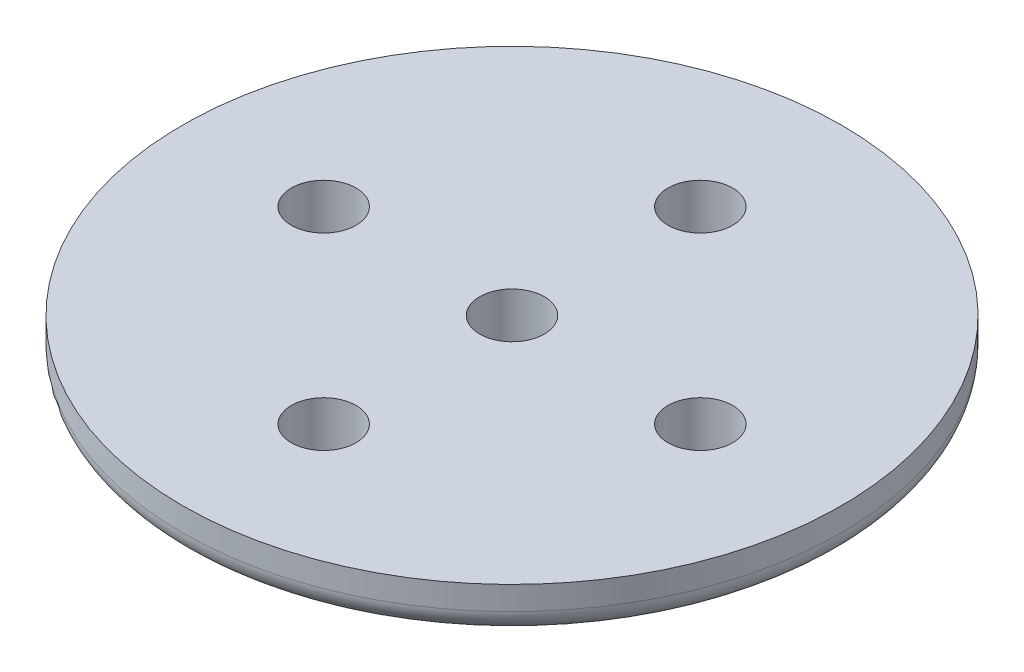
ISO-10303-21;
HEADER;
FILE_DESCRIPTION(('STEP AP214'),'2;1');
FILE_NAME('part.step','',(''),(''),'','','');
FILE_SCHEMA(('AUTOMOTIVE_DESIGN { 1 0 10303 214 1 1 1 1 }'));
ENDSEC;
DATA;
#1=APPLICATION_CONTEXT('core data for automotive mechanical design processes');
#2=APPLICATION_PROTOCOL_DEFINITION('international standard','automotive_design',2000,#1);
#3=PRODUCT_CONTEXT('',#1,'mechanical');
#4=PRODUCT('Part','Part','',(#3));
#5=PRODUCT_RELATED_PRODUCT_CATEGORY('part','',(#4));
#6=PRODUCT_DEFINITION_FORMATION('','',#4);
#7=PRODUCT_DEFINITION_CONTEXT('part definition',#1,'design');
#8=PRODUCT_DEFINITION('design','',#6,#7);
#9=PRODUCT_DEFINITION_SHAPE('','',#8);
#10=(LENGTH_UNIT() NAMED_UNIT(*) SI_UNIT(.MILLI.,.METRE.));
#11=(NAMED_UNIT(*) PLANE_ANGLE_UNIT() SI_UNIT($,.RADIAN.));
#12=(NAMED_UNIT(*) SI_UNIT($,.STERADIAN.) SOLID_ANGLE_UNIT());
#13=UNCERTAINTY_MEASURE_WITH_UNIT(LENGTH_MEASURE(1.E-05),#10,'distance_accuracy_value','');
#14=(GEOMETRIC_REPRESENTATION_CONTEXT(3) GLOBAL_UNCERTAINTY_ASSIGNED_CONTEXT((#13)) GLOBAL_UNIT_ASSIGNED_CONTEXT((#10,
#11,#12)) REPRESENTATION_CONTEXT('',''));
#15=CARTESIAN_POINT('',(0.,0.,0.));
#16=DIRECTION('',(0.,0.,1.));
#17=DIRECTION('',(1.,0.,0.));
#18=AXIS2_PLACEMENT_3D('',#15,#16,#17);
#19=CARTESIAN_POINT('',(0.,0.,0.));
#20=DIRECTION('',(0.,-1.,0.));
#21=DIRECTION('',(0.,0.,-1.));
#22=AXIS2_PLACEMENT_3D('',#19,#20,#21);
#23=PLANE('',#22);
#24=CARTESIAN_POINT('',(12.7,0.,0.));
#25=DIRECTION('',(0.,1.,0.));
#26=DIRECTION('',(0.,0.,1.));
#27=AXIS2_PLACEMENT_3D('',#24,#25,#26);
#28=CIRCLE('',#27,2.1828125);
#29=CARTESIAN_POINT('',(12.7,0.,2.1828125));
#30=VERTEX_POINT('',#29);
#31=EDGE_CURVE('E84',#30,#30,#28,.T.);
#32=ORIENTED_EDGE('',*,*,#31,.T.);
#33=EDGE_LOOP('',(#32));
#34=FACE_BOUND('',#33,.T.);
#35=CARTESIAN_POINT('',(-12.7,0.,0.));
#36=DIRECTION('',(0.,1.,0.));
#37=DIRECTION('',(0.,0.,1.));
#38=AXIS2_PLACEMENT_3D('',#35,#36,#37);
#39=CIRCLE('',#38,2.1828125);
#40=CARTESIAN_POINT('',(-12.7,0.,2.1828125));
#41=VERTEX_POINT('',#40);
#42=EDGE_CURVE('E85',#41,#41,#39,.T.);
#43=ORIENTED_EDGE('',*,*,#42,.T.);
#44=EDGE_LOOP('',(#43));
#45=FACE_BOUND('',#44,.T.);
#46=CARTESIAN_POINT('',(0.,0.,-12.7));
#47=DIRECTION('',(0.,1.,0.));
#48=DIRECTION('',(0.,0.,1.));
#49=AXIS2_PLACEMENT_3D('',#46,#47,#48);
#50=CIRCLE('',#49,2.1828125);
#51=CARTESIAN_POINT('',(0.,0.,-10.5171875));
#52=VERTEX_POINT('',#51);
#53=EDGE_CURVE('E89',#52,#52,#50,.T.);
#54=ORIENTED_EDGE('',*,*,#53,.T.);
#55=EDGE_LOOP('',(#54));
#56=FACE_BOUND('',#55,.T.);
#57=CARTESIAN_POINT('',(0.,0.,12.7));
#58=DIRECTION('',(0.,1.,0.));
#59=DIRECTION('',(0.,0.,1.));
#60=AXIS2_PLACEMENT_3D('',#57,#58,#59);
#61=CIRCLE('',#60,2.1828125);
#62=CARTESIAN_POINT('',(0.,0.,14.8828125));
#63=VERTEX_POINT('',#62);
#64=EDGE_CURVE('E93',#63,#63,#61,.T.);
#65=ORIENTED_EDGE('',*,*,#64,.T.);
#66=EDGE_LOOP('',(#65));
#67=FACE_BOUND('',#66,.T.);
#68=CARTESIAN_POINT('',(0.,0.,0.));
#69=DIRECTION('',(0.,1.,0.));
#70=DIRECTION('',(0.,0.,1.));
#71=AXIS2_PLACEMENT_3D('',#68,#69,#70);
#72=CIRCLE('',#71,2.1828125);
#73=CARTESIAN_POINT('',(0.,0.,2.1828125));
#74=VERTEX_POINT('',#73);
#75=EDGE_CURVE('E60',#74,#74,#72,.T.);
#76=ORIENTED_EDGE('',*,*,#75,.T.);
#77=EDGE_LOOP('',(#76));
#78=FACE_BOUND('',#77,.T.);
#79=CARTESIAN_POINT('',(0.,0.,0.));
#80=DIRECTION('',(0.,-1.,0.));
#81=DIRECTION('',(0.,0.,-1.));
#82=AXIS2_PLACEMENT_3D('',#79,#80,#81);
#83=CIRCLE('',#82,20.6375);
#84=CARTESIAN_POINT('',(0.,0.,-20.6375));
#85=VERTEX_POINT('',#84);
#86=EDGE_CURVE('E10',#85,#85,#83,.T.);
#87=ORIENTED_EDGE('',*,*,#86,.T.);
#88=EDGE_LOOP('',(#87));
#89=FACE_BOUND('',#88,.T.);
#90=ADVANCED_FACE('F37',(#34,#45,#56,#67,#78,#89),#23,.T.);
#91=CARTESIAN_POINT('',(0.,1.5875,0.));
#92=DIRECTION('',(0.,-1.,0.));
#93=DIRECTION('',(0.,0.,-1.));
#94=AXIS2_PLACEMENT_3D('',#91,#92,#93);
#95=TOROIDAL_SURFACE('',#94,20.6375,1.5875);
#96=CARTESIAN_POINT('',(0.,1.5875,0.));
#97=DIRECTION('',(0.,-1.,0.));
#98=DIRECTION('',(0.,0.,-1.));
#99=AXIS2_PLACEMENT_3D('',#96,#97,#98);
#100=CIRCLE('',#99,22.225);
#101=CARTESIAN_POINT('',(0.,1.5875,-22.225));
#102=VERTEX_POINT('',#101);
#103=EDGE_CURVE('E45',#102,#102,#100,.T.);
#104=ORIENTED_EDGE('',*,*,#103,.T.);
#105=EDGE_LOOP('',(#104));
#106=FACE_BOUND('',#105,.T.);
#107=ORIENTED_EDGE('',*,*,#86,.F.);
#108=EDGE_LOOP('',(#107));
#109=FACE_BOUND('',#108,.T.);
#110=ADVANCED_FACE('F119',(#106,#109),#95,.T.);
#111=CARTESIAN_POINT('',(0.,0.,0.));
#112=DIRECTION('',(0.,-1.,0.));
#113=DIRECTION('',(0.,0.,-1.));
#114=AXIS2_PLACEMENT_3D('',#111,#112,#113);
#115=CYLINDRICAL_SURFACE('',#114,22.225);
#116=CARTESIAN_POINT('',(0.,3.175,0.));
#117=DIRECTION('',(0.,-1.,0.));
#118=DIRECTION('',(0.,0.,-1.));
#119=AXIS2_PLACEMENT_3D('',#116,#117,#118);
#120=CIRCLE('',#119,22.225);
#121=CARTESIAN_POINT('',(0.,3.175,-22.225));
#122=VERTEX_POINT('',#121);
#123=EDGE_CURVE('E51',#122,#122,#120,.T.);
#124=ORIENTED_EDGE('',*,*,#123,.T.);
#125=EDGE_LOOP('',(#124));
#126=FACE_BOUND('',#125,.T.);
#127=ORIENTED_EDGE('',*,*,#103,.F.);
#128=EDGE_LOOP('',(#127));
#129=FACE_BOUND('',#128,.T.);
#130=ADVANCED_FACE('F124',(#126,#129),#115,.T.);
#131=CARTESIAN_POINT('',(0.,3.175,0.));
#132=DIRECTION('',(0.,1.,0.));
#133=DIRECTION('',(0.,0.,1.));
#134=AXIS2_PLACEMENT_3D('',#131,#132,#133);
#135=PLANE('',#134);
#136=CARTESIAN_POINT('',(12.7,3.175,0.));
#137=DIRECTION('',(0.,1.,0.));
#138=DIRECTION('',(0.,0.,1.));
#139=AXIS2_PLACEMENT_3D('',#136,#137,#138);
#140=CIRCLE('',#139,2.1828125);
#141=CARTESIAN_POINT('',(12.7,3.175,2.1828125));
#142=VERTEX_POINT('',#141);
#143=EDGE_CURVE('E40',#142,#142,#140,.T.);
#144=ORIENTED_EDGE('',*,*,#143,.F.);
#145=EDGE_LOOP('',(#144));
#146=FACE_BOUND('',#145,.T.);
#147=CARTESIAN_POINT('',(-12.7,3.175,0.));
#148=DIRECTION('',(0.,1.,0.));
#149=DIRECTION('',(0.,0.,1.));
#150=AXIS2_PLACEMENT_3D('',#147,#148,#149);
#151=CIRCLE('',#150,2.1828125);
#152=CARTESIAN_POINT('',(-12.7,3.175,2.1828125));
#153=VERTEX_POINT('',#152);
#154=EDGE_CURVE('E67',#153,#153,#151,.T.);
#155=ORIENTED_EDGE('',*,*,#154,.F.);
#156=EDGE_LOOP('',(#155));
#157=FACE_BOUND('',#156,.T.);
#158=CARTESIAN_POINT('',(0.,3.175,-12.7));
#159=DIRECTION('',(0.,1.,0.));
#160=DIRECTION('',(0.,0.,1.));
#161=AXIS2_PLACEMENT_3D('',#158,#159,#160);
#162=CIRCLE('',#161,2.1828125);
#163=CARTESIAN_POINT('',(0.,3.175,-10.5171875));
#164=VERTEX_POINT('',#163);
#165=EDGE_CURVE('E64',#164,#164,#162,.T.);
#166=ORIENTED_EDGE('',*,*,#165,.F.);
#167=EDGE_LOOP('',(#166));
#168=FACE_BOUND('',#167,.T.);
#169=CARTESIAN_POINT('',(0.,3.175,12.7));
#170=DIRECTION('',(0.,1.,0.));
#171=DIRECTION('',(0.,0.,1.));
#172=AXIS2_PLACEMENT_3D('',#169,#170,#171);
#173=CIRCLE('',#172,2.1828125);
#174=CARTESIAN_POINT('',(0.,3.175,14.8828125));
#175=VERTEX_POINT('',#174);
#176=EDGE_CURVE('E59',#175,#175,#173,.T.);
#177=ORIENTED_EDGE('',*,*,#176,.F.);
#178=EDGE_LOOP('',(#177));
#179=FACE_BOUND('',#178,.T.);
#180=CARTESIAN_POINT('',(0.,3.175,0.));
#181=DIRECTION('',(0.,1.,0.));
#182=DIRECTION('',(0.,0.,1.));
#183=AXIS2_PLACEMENT_3D('',#180,#181,#182);
#184=CIRCLE('',#183,2.1828125);
#185=CARTESIAN_POINT('',(0.,3.175,2.1828125));
#186=VERTEX_POINT('',#185);
#187=EDGE_CURVE('E55',#186,#186,#184,.T.);
#188=ORIENTED_EDGE('',*,*,#187,.F.);
#189=EDGE_LOOP('',(#188));
#190=FACE_BOUND('',#189,.T.);
#191=ORIENTED_EDGE('',*,*,#123,.F.);
#192=EDGE_LOOP('',(#191));
#193=FACE_BOUND('',#192,.T.);
#194=ADVANCED_FACE('F138',(#146,#157,#168,#179,#190,#193),#135,.T.);
#195=CARTESIAN_POINT('',(0.,0.,0.));
#196=DIRECTION('',(0.,1.,0.));
#197=DIRECTION('',(0.,0.,1.));
#198=AXIS2_PLACEMENT_3D('',#195,#196,#197);
#199=CYLINDRICAL_SURFACE('',#198,2.1828125);
#200=ORIENTED_EDGE('',*,*,#187,.T.);
#201=EDGE_LOOP('',(#200));
#202=FACE_BOUND('',#201,.T.);
#203=ORIENTED_EDGE('',*,*,#75,.F.);
#204=EDGE_LOOP('',(#203));
#205=FACE_BOUND('',#204,.T.);
#206=ADVANCED_FACE('F115',(#202,#205),#199,.F.);
#207=CARTESIAN_POINT('',(0.,0.,12.7));
#208=DIRECTION('',(0.,1.,0.));
#209=DIRECTION('',(0.,0.,1.));
#210=AXIS2_PLACEMENT_3D('',#207,#208,#209);
#211=CYLINDRICAL_SURFACE('',#210,2.1828125);
#212=ORIENTED_EDGE('',*,*,#176,.T.);
#213=EDGE_LOOP('',(#212));
#214=FACE_BOUND('',#213,.T.);
#215=ORIENTED_EDGE('',*,*,#64,.F.);
#216=EDGE_LOOP('',(#215));
#217=FACE_BOUND('',#216,.T.);
#218=ADVANCED_FACE('F106',(#214,#217),#211,.F.);
#219=CARTESIAN_POINT('',(0.,0.,-12.7));
#220=DIRECTION('',(0.,1.,0.));
#221=DIRECTION('',(0.,0.,1.));
#222=AXIS2_PLACEMENT_3D('',#219,#220,#221);
#223=CYLINDRICAL_SURFACE('',#222,2.1828125);
#224=ORIENTED_EDGE('',*,*,#165,.T.);
#225=EDGE_LOOP('',(#224));
#226=FACE_BOUND('',#225,.T.);
#227=ORIENTED_EDGE('',*,*,#53,.F.);
#228=EDGE_LOOP('',(#227));
#229=FACE_BOUND('',#228,.T.);
#230=ADVANCED_FACE('F103',(#226,#229),#223,.F.);
#231=CARTESIAN_POINT('',(-12.7,0.,0.));
#232=DIRECTION('',(0.,1.,0.));
#233=DIRECTION('',(0.,0.,1.));
#234=AXIS2_PLACEMENT_3D('',#231,#232,#233);
#235=CYLINDRICAL_SURFACE('',#234,2.1828125);
#236=ORIENTED_EDGE('',*,*,#154,.T.);
#237=EDGE_LOOP('',(#236));
#238=FACE_BOUND('',#237,.T.);
#239=ORIENTED_EDGE('',*,*,#42,.F.);
#240=EDGE_LOOP('',(#239));
#241=FACE_BOUND('',#240,.T.);
#242=ADVANCED_FACE('F105',(#238,#241),#235,.F.);
#243=CARTESIAN_POINT('',(12.7,0.,0.));
#244=DIRECTION('',(0.,1.,0.));
#245=DIRECTION('',(0.,0.,1.));
#246=AXIS2_PLACEMENT_3D('',#243,#244,#245);
#247=CYLINDRICAL_SURFACE('',#246,2.1828125);
#248=ORIENTED_EDGE('',*,*,#143,.T.);
#249=EDGE_LOOP('',(#248));
#250=FACE_BOUND('',#249,.T.);
#251=ORIENTED_EDGE('',*,*,#31,.F.);
#252=EDGE_LOOP('',(#251));
#253=FACE_BOUND('',#252,.T.);
#254=ADVANCED_FACE('F113',(#250,#253),#247,.F.);
#255=CLOSED_SHELL('',(#90,#110,#130,#194,#206,#218,#230,#242,#254));
#256=MANIFOLD_SOLID_BREP('B2',#255);
#257=ADVANCED_BREP_SHAPE_REPRESENTATION('',(#18,#256),#14);
#258=SHAPE_DEFINITION_REPRESENTATION(#9,#257);
ENDSEC;
END-ISO-10303-21;
